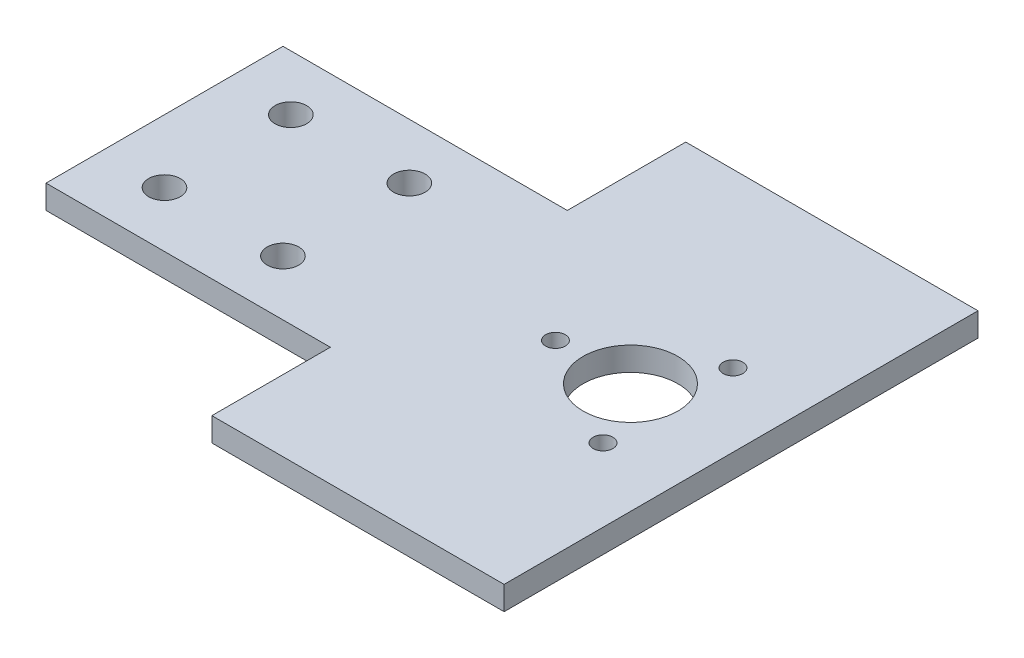
ISO-10303-21;
HEADER;
FILE_DESCRIPTION(('STEP AP214'),'2;1');
FILE_NAME('part.step','',(''),(''),'','','');
FILE_SCHEMA(('AUTOMOTIVE_DESIGN { 1 0 10303 214 1 1 1 1 }'));
ENDSEC;
DATA;
#1=APPLICATION_CONTEXT('core data for automotive mechanical design processes');
#2=APPLICATION_PROTOCOL_DEFINITION('international standard','automotive_design',2000,#1);
#3=PRODUCT_CONTEXT('',#1,'mechanical');
#4=PRODUCT('Part','Part','',(#3));
#5=PRODUCT_RELATED_PRODUCT_CATEGORY('part','',(#4));
#6=PRODUCT_DEFINITION_FORMATION('','',#4);
#7=PRODUCT_DEFINITION_CONTEXT('part definition',#1,'design');
#8=PRODUCT_DEFINITION('design','',#6,#7);
#9=PRODUCT_DEFINITION_SHAPE('','',#8);
#10=(LENGTH_UNIT() NAMED_UNIT(*) SI_UNIT(.MILLI.,.METRE.));
#11=(NAMED_UNIT(*) PLANE_ANGLE_UNIT() SI_UNIT($,.RADIAN.));
#12=(NAMED_UNIT(*) SI_UNIT($,.STERADIAN.) SOLID_ANGLE_UNIT());
#13=UNCERTAINTY_MEASURE_WITH_UNIT(LENGTH_MEASURE(1.E-05),#10,'distance_accuracy_value','');
#14=(GEOMETRIC_REPRESENTATION_CONTEXT(3) GLOBAL_UNCERTAINTY_ASSIGNED_CONTEXT((#13)) GLOBAL_UNIT_ASSIGNED_CONTEXT((#10,
#11,#12)) REPRESENTATION_CONTEXT('',''));
#15=CARTESIAN_POINT('',(0.,0.,0.));
#16=DIRECTION('',(0.,0.,1.));
#17=DIRECTION('',(1.,0.,0.));
#18=AXIS2_PLACEMENT_3D('',#15,#16,#17);
#19=CARTESIAN_POINT('',(36.,3.,0.));
#20=DIRECTION('',(0.,0.,-1.));
#21=DIRECTION('',(-1.,0.,0.));
#22=AXIS2_PLACEMENT_3D('',#19,#20,#21);
#23=PLANE('',#22);
#24=DIRECTION('',(1.,0.,0.));
#25=VECTOR('',#24,1.);
#26=CARTESIAN_POINT('',(36.,0.,0.));
#27=LINE('',#26,#25);
#28=CARTESIAN_POINT('',(0.,0.,0.));
#29=VERTEX_POINT('',#28);
#30=CARTESIAN_POINT('',(36.,0.,0.));
#31=VERTEX_POINT('',#30);
#32=EDGE_CURVE('E129',#29,#31,#27,.T.);
#33=ORIENTED_EDGE('',*,*,#32,.T.);
#34=DIRECTION('',(0.,-1.,0.));
#35=VECTOR('',#34,1.);
#36=CARTESIAN_POINT('',(36.,3.,0.));
#37=LINE('',#36,#35);
#38=CARTESIAN_POINT('',(36.,3.,0.));
#39=VERTEX_POINT('',#38);
#40=EDGE_CURVE('E11',#39,#31,#37,.T.);
#41=ORIENTED_EDGE('',*,*,#40,.F.);
#42=DIRECTION('',(1.,0.,0.));
#43=VECTOR('',#42,1.);
#44=CARTESIAN_POINT('',(36.,3.,0.));
#45=LINE('',#44,#43);
#46=CARTESIAN_POINT('',(0.,3.,0.));
#47=VERTEX_POINT('',#46);
#48=EDGE_CURVE('E144',#47,#39,#45,.T.);
#49=ORIENTED_EDGE('',*,*,#48,.F.);
#50=DIRECTION('',(0.,-1.,0.));
#51=VECTOR('',#50,1.);
#52=CARTESIAN_POINT('',(0.,3.,0.));
#53=LINE('',#52,#51);
#54=EDGE_CURVE('E125',#47,#29,#53,.T.);
#55=ORIENTED_EDGE('',*,*,#54,.T.);
#56=EDGE_LOOP('',(#33,#41,#49,#55));
#57=FACE_BOUND('',#56,.T.);
#58=ADVANCED_FACE('F33',(#57),#23,.F.);
#59=CARTESIAN_POINT('',(36.,3.,15.));
#60=DIRECTION('',(1.,0.,0.));
#61=DIRECTION('',(0.,0.,-1.));
#62=AXIS2_PLACEMENT_3D('',#59,#60,#61);
#63=PLANE('',#62);
#64=DIRECTION('',(0.,0.,1.));
#65=VECTOR('',#64,1.);
#66=CARTESIAN_POINT('',(36.,0.,15.));
#67=LINE('',#66,#65);
#68=CARTESIAN_POINT('',(36.,0.,15.));
#69=VERTEX_POINT('',#68);
#70=EDGE_CURVE('E132',#31,#69,#67,.T.);
#71=ORIENTED_EDGE('',*,*,#70,.T.);
#72=DIRECTION('',(0.,-1.,0.));
#73=VECTOR('',#72,1.);
#74=CARTESIAN_POINT('',(36.,3.,15.));
#75=LINE('',#74,#73);
#76=CARTESIAN_POINT('',(36.,3.,15.));
#77=VERTEX_POINT('',#76);
#78=EDGE_CURVE('E41',#77,#69,#75,.T.);
#79=ORIENTED_EDGE('',*,*,#78,.F.);
#80=DIRECTION('',(0.,0.,1.));
#81=VECTOR('',#80,1.);
#82=CARTESIAN_POINT('',(36.,3.,15.));
#83=LINE('',#82,#81);
#84=EDGE_CURVE('E92',#39,#77,#83,.T.);
#85=ORIENTED_EDGE('',*,*,#84,.F.);
#86=ORIENTED_EDGE('',*,*,#40,.T.);
#87=EDGE_LOOP('',(#71,#79,#85,#86));
#88=FACE_BOUND('',#87,.T.);
#89=ADVANCED_FACE('F268',(#88),#63,.F.);
#90=CARTESIAN_POINT('',(73.,3.,15.));
#91=DIRECTION('',(0.,0.,-1.));
#92=DIRECTION('',(-1.,0.,0.));
#93=AXIS2_PLACEMENT_3D('',#90,#91,#92);
#94=PLANE('',#93);
#95=DIRECTION('',(1.,0.,0.));
#96=VECTOR('',#95,1.);
#97=CARTESIAN_POINT('',(73.,0.,15.));
#98=LINE('',#97,#96);
#99=CARTESIAN_POINT('',(73.,0.,15.));
#100=VERTEX_POINT('',#99);
#101=EDGE_CURVE('E135',#69,#100,#98,.T.);
#102=ORIENTED_EDGE('',*,*,#101,.T.);
#103=DIRECTION('',(0.,-1.,0.));
#104=VECTOR('',#103,1.);
#105=CARTESIAN_POINT('',(73.,3.,15.));
#106=LINE('',#105,#104);
#107=CARTESIAN_POINT('',(73.,3.,15.));
#108=VERTEX_POINT('',#107);
#109=EDGE_CURVE('E151',#108,#100,#106,.T.);
#110=ORIENTED_EDGE('',*,*,#109,.F.);
#111=DIRECTION('',(1.,0.,0.));
#112=VECTOR('',#111,1.);
#113=CARTESIAN_POINT('',(73.,3.,15.));
#114=LINE('',#113,#112);
#115=EDGE_CURVE('E159',#77,#108,#114,.T.);
#116=ORIENTED_EDGE('',*,*,#115,.F.);
#117=ORIENTED_EDGE('',*,*,#78,.T.);
#118=EDGE_LOOP('',(#102,#110,#116,#117));
#119=FACE_BOUND('',#118,.T.);
#120=ADVANCED_FACE('F157',(#119),#94,.F.);
#121=CARTESIAN_POINT('',(73.,3.,-45.));
#122=DIRECTION('',(-1.,0.,0.));
#123=DIRECTION('',(0.,0.,1.));
#124=AXIS2_PLACEMENT_3D('',#121,#122,#123);
#125=PLANE('',#124);
#126=DIRECTION('',(0.,0.,-1.));
#127=VECTOR('',#126,1.);
#128=CARTESIAN_POINT('',(73.,0.,-45.));
#129=LINE('',#128,#127);
#130=CARTESIAN_POINT('',(73.,0.,-45.));
#131=VERTEX_POINT('',#130);
#132=EDGE_CURVE('E137',#100,#131,#129,.T.);
#133=ORIENTED_EDGE('',*,*,#132,.T.);
#134=DIRECTION('',(0.,-1.,0.));
#135=VECTOR('',#134,1.);
#136=CARTESIAN_POINT('',(73.,3.,-45.));
#137=LINE('',#136,#135);
#138=CARTESIAN_POINT('',(73.,3.,-45.));
#139=VERTEX_POINT('',#138);
#140=EDGE_CURVE('E148',#139,#131,#137,.T.);
#141=ORIENTED_EDGE('',*,*,#140,.F.);
#142=DIRECTION('',(0.,0.,-1.));
#143=VECTOR('',#142,1.);
#144=CARTESIAN_POINT('',(73.,3.,-45.));
#145=LINE('',#144,#143);
#146=EDGE_CURVE('E171',#108,#139,#145,.T.);
#147=ORIENTED_EDGE('',*,*,#146,.F.);
#148=ORIENTED_EDGE('',*,*,#109,.T.);
#149=EDGE_LOOP('',(#133,#141,#147,#148));
#150=FACE_BOUND('',#149,.T.);
#151=ADVANCED_FACE('F167',(#150),#125,.F.);
#152=CARTESIAN_POINT('',(36.,3.,-45.));
#153=DIRECTION('',(0.,0.,1.));
#154=DIRECTION('',(1.,0.,0.));
#155=AXIS2_PLACEMENT_3D('',#152,#153,#154);
#156=PLANE('',#155);
#157=DIRECTION('',(-1.,0.,0.));
#158=VECTOR('',#157,1.);
#159=CARTESIAN_POINT('',(36.,0.,-45.));
#160=LINE('',#159,#158);
#161=CARTESIAN_POINT('',(36.,0.,-45.));
#162=VERTEX_POINT('',#161);
#163=EDGE_CURVE('E139',#131,#162,#160,.T.);
#164=ORIENTED_EDGE('',*,*,#163,.T.);
#165=DIRECTION('',(0.,-1.,0.));
#166=VECTOR('',#165,1.);
#167=CARTESIAN_POINT('',(36.,3.,-45.));
#168=LINE('',#167,#166);
#169=CARTESIAN_POINT('',(36.,3.,-45.));
#170=VERTEX_POINT('',#169);
#171=EDGE_CURVE('E120',#170,#162,#168,.T.);
#172=ORIENTED_EDGE('',*,*,#171,.F.);
#173=DIRECTION('',(-1.,0.,0.));
#174=VECTOR('',#173,1.);
#175=CARTESIAN_POINT('',(36.,3.,-45.));
#176=LINE('',#175,#174);
#177=EDGE_CURVE('E111',#139,#170,#176,.T.);
#178=ORIENTED_EDGE('',*,*,#177,.F.);
#179=ORIENTED_EDGE('',*,*,#140,.T.);
#180=EDGE_LOOP('',(#164,#172,#178,#179));
#181=FACE_BOUND('',#180,.T.);
#182=ADVANCED_FACE('F170',(#181),#156,.F.);
#183=CARTESIAN_POINT('',(36.,3.,-30.));
#184=DIRECTION('',(1.,0.,0.));
#185=DIRECTION('',(0.,0.,-1.));
#186=AXIS2_PLACEMENT_3D('',#183,#184,#185);
#187=PLANE('',#186);
#188=DIRECTION('',(0.,0.,1.));
#189=VECTOR('',#188,1.);
#190=CARTESIAN_POINT('',(36.,0.,-30.));
#191=LINE('',#190,#189);
#192=CARTESIAN_POINT('',(36.,0.,-30.));
#193=VERTEX_POINT('',#192);
#194=EDGE_CURVE('E119',#162,#193,#191,.T.);
#195=ORIENTED_EDGE('',*,*,#194,.T.);
#196=DIRECTION('',(0.,-1.,0.));
#197=VECTOR('',#196,1.);
#198=CARTESIAN_POINT('',(36.,3.,-30.));
#199=LINE('',#198,#197);
#200=CARTESIAN_POINT('',(36.,3.,-30.));
#201=VERTEX_POINT('',#200);
#202=EDGE_CURVE('E116',#201,#193,#199,.T.);
#203=ORIENTED_EDGE('',*,*,#202,.F.);
#204=DIRECTION('',(0.,0.,1.));
#205=VECTOR('',#204,1.);
#206=CARTESIAN_POINT('',(36.,3.,-30.));
#207=LINE('',#206,#205);
#208=EDGE_CURVE('E105',#170,#201,#207,.T.);
#209=ORIENTED_EDGE('',*,*,#208,.F.);
#210=ORIENTED_EDGE('',*,*,#171,.T.);
#211=EDGE_LOOP('',(#195,#203,#209,#210));
#212=FACE_BOUND('',#211,.T.);
#213=ADVANCED_FACE('F117',(#212),#187,.F.);
#214=CARTESIAN_POINT('',(0.,3.,-30.));
#215=DIRECTION('',(0.,0.,1.));
#216=DIRECTION('',(1.,0.,0.));
#217=AXIS2_PLACEMENT_3D('',#214,#215,#216);
#218=PLANE('',#217);
#219=DIRECTION('',(-1.,0.,0.));
#220=VECTOR('',#219,1.);
#221=CARTESIAN_POINT('',(0.,0.,-30.));
#222=LINE('',#221,#220);
#223=CARTESIAN_POINT('',(0.,0.,-30.));
#224=VERTEX_POINT('',#223);
#225=EDGE_CURVE('E78',#193,#224,#222,.T.);
#226=ORIENTED_EDGE('',*,*,#225,.T.);
#227=DIRECTION('',(0.,-1.,0.));
#228=VECTOR('',#227,1.);
#229=CARTESIAN_POINT('',(0.,3.,-30.));
#230=LINE('',#229,#228);
#231=CARTESIAN_POINT('',(0.,3.,-30.));
#232=VERTEX_POINT('',#231);
#233=EDGE_CURVE('E121',#232,#224,#230,.T.);
#234=ORIENTED_EDGE('',*,*,#233,.F.);
#235=DIRECTION('',(-1.,0.,0.));
#236=VECTOR('',#235,1.);
#237=CARTESIAN_POINT('',(0.,3.,-30.));
#238=LINE('',#237,#236);
#239=EDGE_CURVE('E109',#201,#232,#238,.T.);
#240=ORIENTED_EDGE('',*,*,#239,.F.);
#241=ORIENTED_EDGE('',*,*,#202,.T.);
#242=EDGE_LOOP('',(#226,#234,#240,#241));
#243=FACE_BOUND('',#242,.T.);
#244=ADVANCED_FACE('F123',(#243),#218,.F.);
#245=CARTESIAN_POINT('',(0.,3.,0.));
#246=DIRECTION('',(1.,0.,0.));
#247=DIRECTION('',(0.,0.,-1.));
#248=AXIS2_PLACEMENT_3D('',#245,#246,#247);
#249=PLANE('',#248);
#250=DIRECTION('',(0.,0.,1.));
#251=VECTOR('',#250,1.);
#252=CARTESIAN_POINT('',(0.,0.,0.));
#253=LINE('',#252,#251);
#254=EDGE_CURVE('E84',#224,#29,#253,.T.);
#255=ORIENTED_EDGE('',*,*,#254,.T.);
#256=ORIENTED_EDGE('',*,*,#54,.F.);
#257=DIRECTION('',(0.,0.,1.));
#258=VECTOR('',#257,1.);
#259=CARTESIAN_POINT('',(0.,3.,0.));
#260=LINE('',#259,#258);
#261=EDGE_CURVE('E49',#232,#47,#260,.T.);
#262=ORIENTED_EDGE('',*,*,#261,.F.);
#263=ORIENTED_EDGE('',*,*,#233,.T.);
#264=EDGE_LOOP('',(#255,#256,#262,#263));
#265=FACE_BOUND('',#264,.T.);
#266=ADVANCED_FACE('F236',(#265),#249,.F.);
#267=CARTESIAN_POINT('',(0.,3.,0.));
#268=DIRECTION('',(0.,-1.,0.));
#269=DIRECTION('',(0.,0.,-1.));
#270=AXIS2_PLACEMENT_3D('',#267,#268,#269);
#271=PLANE('',#270);
#272=CARTESIAN_POINT('',(63.75,3.,-23.2272413359521));
#273=DIRECTION('',(0.,1.,0.));
#274=DIRECTION('',(0.,0.,1.));
#275=AXIS2_PLACEMENT_3D('',#272,#273,#274);
#276=CIRCLE('',#275,1.25000000000001);
#277=CARTESIAN_POINT('',(63.75,3.,-21.9772413359521));
#278=VERTEX_POINT('',#277);
#279=EDGE_CURVE('E219',#278,#278,#276,.T.);
#280=ORIENTED_EDGE('',*,*,#279,.F.);
#281=EDGE_LOOP('',(#280));
#282=FACE_BOUND('',#281,.T.);
#283=CARTESIAN_POINT('',(63.75,3.,-6.77275866404786));
#284=DIRECTION('',(0.,1.,0.));
#285=DIRECTION('',(0.,0.,1.));
#286=AXIS2_PLACEMENT_3D('',#283,#284,#285);
#287=CIRCLE('',#286,1.24999999999997);
#288=CARTESIAN_POINT('',(63.75,3.,-5.52275866404789));
#289=VERTEX_POINT('',#288);
#290=EDGE_CURVE('E213',#289,#289,#287,.T.);
#291=ORIENTED_EDGE('',*,*,#290,.F.);
#292=EDGE_LOOP('',(#291));
#293=FACE_BOUND('',#292,.T.);
#294=CARTESIAN_POINT('',(49.5,3.,-15.));
#295=DIRECTION('',(0.,1.,0.));
#296=DIRECTION('',(0.,0.,1.));
#297=AXIS2_PLACEMENT_3D('',#294,#295,#296);
#298=CIRCLE('',#297,1.25000000000001);
#299=CARTESIAN_POINT('',(49.5,3.,-13.75));
#300=VERTEX_POINT('',#299);
#301=EDGE_CURVE('E207',#300,#300,#298,.T.);
#302=ORIENTED_EDGE('',*,*,#301,.F.);
#303=EDGE_LOOP('',(#302));
#304=FACE_BOUND('',#303,.T.);
#305=CARTESIAN_POINT('',(23.,3.,-23.));
#306=DIRECTION('',(0.,1.,0.));
#307=DIRECTION('',(0.,0.,1.));
#308=AXIS2_PLACEMENT_3D('',#305,#306,#307);
#309=CIRCLE('',#308,2.);
#310=CARTESIAN_POINT('',(23.,3.,-21.));
#311=VERTEX_POINT('',#310);
#312=EDGE_CURVE('E190',#311,#311,#309,.T.);
#313=ORIENTED_EDGE('',*,*,#312,.F.);
#314=EDGE_LOOP('',(#313));
#315=FACE_BOUND('',#314,.T.);
#316=CARTESIAN_POINT('',(8.,3.,-7.));
#317=DIRECTION('',(0.,1.,0.));
#318=DIRECTION('',(0.,0.,1.));
#319=AXIS2_PLACEMENT_3D('',#316,#317,#318);
#320=CIRCLE('',#319,2.);
#321=CARTESIAN_POINT('',(8.,3.,-5.));
#322=VERTEX_POINT('',#321);
#323=EDGE_CURVE('E183',#322,#322,#320,.T.);
#324=ORIENTED_EDGE('',*,*,#323,.F.);
#325=EDGE_LOOP('',(#324));
#326=FACE_BOUND('',#325,.T.);
#327=CARTESIAN_POINT('',(23.,3.,-7.));
#328=DIRECTION('',(0.,1.,0.));
#329=DIRECTION('',(0.,0.,1.));
#330=AXIS2_PLACEMENT_3D('',#327,#328,#329);
#331=CIRCLE('',#330,2.);
#332=CARTESIAN_POINT('',(23.,3.,-5.));
#333=VERTEX_POINT('',#332);
#334=EDGE_CURVE('E202',#333,#333,#331,.T.);
#335=ORIENTED_EDGE('',*,*,#334,.F.);
#336=EDGE_LOOP('',(#335));
#337=FACE_BOUND('',#336,.T.);
#338=CARTESIAN_POINT('',(59.,3.,-15.));
#339=DIRECTION('',(0.,1.,0.));
#340=DIRECTION('',(0.,0.,1.));
#341=AXIS2_PLACEMENT_3D('',#338,#339,#340);
#342=CIRCLE('',#341,6.);
#343=CARTESIAN_POINT('',(59.,3.,-9.));
#344=VERTEX_POINT('',#343);
#345=EDGE_CURVE('E195',#344,#344,#342,.T.);
#346=ORIENTED_EDGE('',*,*,#345,.F.);
#347=EDGE_LOOP('',(#346));
#348=FACE_BOUND('',#347,.T.);
#349=CARTESIAN_POINT('',(8.,3.,-23.));
#350=DIRECTION('',(0.,1.,0.));
#351=DIRECTION('',(0.,0.,1.));
#352=AXIS2_PLACEMENT_3D('',#349,#350,#351);
#353=CIRCLE('',#352,2.);
#354=CARTESIAN_POINT('',(8.,3.,-21.));
#355=VERTEX_POINT('',#354);
#356=EDGE_CURVE('E177',#355,#355,#353,.T.);
#357=ORIENTED_EDGE('',*,*,#356,.F.);
#358=EDGE_LOOP('',(#357));
#359=FACE_BOUND('',#358,.T.);
#360=ORIENTED_EDGE('',*,*,#48,.T.);
#361=ORIENTED_EDGE('',*,*,#84,.T.);
#362=ORIENTED_EDGE('',*,*,#115,.T.);
#363=ORIENTED_EDGE('',*,*,#146,.T.);
#364=ORIENTED_EDGE('',*,*,#177,.T.);
#365=ORIENTED_EDGE('',*,*,#208,.T.);
#366=ORIENTED_EDGE('',*,*,#239,.T.);
#367=ORIENTED_EDGE('',*,*,#261,.T.);
#368=EDGE_LOOP('',(#360,#361,#362,#363,#364,#365,#366,#367));
#369=FACE_BOUND('',#368,.T.);
#370=ADVANCED_FACE('F107',(#282,#293,#304,#315,#326,#337,#348,#359,#369),#271,.F.);
#371=CARTESIAN_POINT('',(0.,0.,0.));
#372=DIRECTION('',(0.,-1.,0.));
#373=DIRECTION('',(0.,0.,-1.));
#374=AXIS2_PLACEMENT_3D('',#371,#372,#373);
#375=PLANE('',#374);
#376=CARTESIAN_POINT('',(63.75,0.,-23.2272413359521));
#377=DIRECTION('',(0.,1.,0.));
#378=DIRECTION('',(0.,0.,1.));
#379=AXIS2_PLACEMENT_3D('',#376,#377,#378);
#380=CIRCLE('',#379,1.25000000000001);
#381=CARTESIAN_POINT('',(63.75,0.,-21.9772413359521));
#382=VERTEX_POINT('',#381);
#383=EDGE_CURVE('E199',#382,#382,#380,.T.);
#384=ORIENTED_EDGE('',*,*,#383,.T.);
#385=EDGE_LOOP('',(#384));
#386=FACE_BOUND('',#385,.T.);
#387=CARTESIAN_POINT('',(63.75,0.,-6.77275866404786));
#388=DIRECTION('',(0.,1.,0.));
#389=DIRECTION('',(0.,0.,1.));
#390=AXIS2_PLACEMENT_3D('',#387,#388,#389);
#391=CIRCLE('',#390,1.24999999999997);
#392=CARTESIAN_POINT('',(63.75,0.,-5.52275866404789));
#393=VERTEX_POINT('',#392);
#394=EDGE_CURVE('E216',#393,#393,#391,.T.);
#395=ORIENTED_EDGE('',*,*,#394,.T.);
#396=EDGE_LOOP('',(#395));
#397=FACE_BOUND('',#396,.T.);
#398=CARTESIAN_POINT('',(49.5,0.,-15.));
#399=DIRECTION('',(0.,1.,0.));
#400=DIRECTION('',(0.,0.,1.));
#401=AXIS2_PLACEMENT_3D('',#398,#399,#400);
#402=CIRCLE('',#401,1.25000000000001);
#403=CARTESIAN_POINT('',(49.5,0.,-13.75));
#404=VERTEX_POINT('',#403);
#405=EDGE_CURVE('E210',#404,#404,#402,.T.);
#406=ORIENTED_EDGE('',*,*,#405,.T.);
#407=EDGE_LOOP('',(#406));
#408=FACE_BOUND('',#407,.T.);
#409=CARTESIAN_POINT('',(23.,0.,-23.));
#410=DIRECTION('',(0.,1.,0.));
#411=DIRECTION('',(0.,0.,1.));
#412=AXIS2_PLACEMENT_3D('',#409,#410,#411);
#413=CIRCLE('',#412,2.);
#414=CARTESIAN_POINT('',(23.,0.,-21.));
#415=VERTEX_POINT('',#414);
#416=EDGE_CURVE('E180',#415,#415,#413,.T.);
#417=ORIENTED_EDGE('',*,*,#416,.T.);
#418=EDGE_LOOP('',(#417));
#419=FACE_BOUND('',#418,.T.);
#420=CARTESIAN_POINT('',(8.,0.,-7.));
#421=DIRECTION('',(0.,1.,0.));
#422=DIRECTION('',(0.,0.,1.));
#423=AXIS2_PLACEMENT_3D('',#420,#421,#422);
#424=CIRCLE('',#423,2.);
#425=CARTESIAN_POINT('',(8.,0.,-5.));
#426=VERTEX_POINT('',#425);
#427=EDGE_CURVE('E186',#426,#426,#424,.T.);
#428=ORIENTED_EDGE('',*,*,#427,.T.);
#429=EDGE_LOOP('',(#428));
#430=FACE_BOUND('',#429,.T.);
#431=CARTESIAN_POINT('',(23.,0.,-7.));
#432=DIRECTION('',(0.,1.,0.));
#433=DIRECTION('',(0.,0.,1.));
#434=AXIS2_PLACEMENT_3D('',#431,#432,#433);
#435=CIRCLE('',#434,2.);
#436=CARTESIAN_POINT('',(23.,0.,-5.));
#437=VERTEX_POINT('',#436);
#438=EDGE_CURVE('E187',#437,#437,#435,.T.);
#439=ORIENTED_EDGE('',*,*,#438,.T.);
#440=EDGE_LOOP('',(#439));
#441=FACE_BOUND('',#440,.T.);
#442=CARTESIAN_POINT('',(59.,0.,-15.));
#443=DIRECTION('',(0.,1.,0.));
#444=DIRECTION('',(0.,0.,1.));
#445=AXIS2_PLACEMENT_3D('',#442,#443,#444);
#446=CIRCLE('',#445,6.);
#447=CARTESIAN_POINT('',(59.,0.,-9.));
#448=VERTEX_POINT('',#447);
#449=EDGE_CURVE('E198',#448,#448,#446,.T.);
#450=ORIENTED_EDGE('',*,*,#449,.T.);
#451=EDGE_LOOP('',(#450));
#452=FACE_BOUND('',#451,.T.);
#453=CARTESIAN_POINT('',(8.,0.,-23.));
#454=DIRECTION('',(0.,1.,0.));
#455=DIRECTION('',(0.,0.,1.));
#456=AXIS2_PLACEMENT_3D('',#453,#454,#455);
#457=CIRCLE('',#456,2.);
#458=CARTESIAN_POINT('',(8.,0.,-21.));
#459=VERTEX_POINT('',#458);
#460=EDGE_CURVE('E133',#459,#459,#457,.T.);
#461=ORIENTED_EDGE('',*,*,#460,.T.);
#462=EDGE_LOOP('',(#461));
#463=FACE_BOUND('',#462,.T.);
#464=ORIENTED_EDGE('',*,*,#32,.F.);
#465=ORIENTED_EDGE('',*,*,#254,.F.);
#466=ORIENTED_EDGE('',*,*,#225,.F.);
#467=ORIENTED_EDGE('',*,*,#194,.F.);
#468=ORIENTED_EDGE('',*,*,#163,.F.);
#469=ORIENTED_EDGE('',*,*,#132,.F.);
#470=ORIENTED_EDGE('',*,*,#101,.F.);
#471=ORIENTED_EDGE('',*,*,#70,.F.);
#472=EDGE_LOOP('',(#464,#465,#466,#467,#468,#469,#470,#471));
#473=FACE_BOUND('',#472,.T.);
#474=ADVANCED_FACE('F163',(#386,#397,#408,#419,#430,#441,#452,#463,#473),#375,.T.);
#475=CARTESIAN_POINT('',(8.,0.,-23.));
#476=DIRECTION('',(0.,1.,0.));
#477=DIRECTION('',(0.,0.,1.));
#478=AXIS2_PLACEMENT_3D('',#475,#476,#477);
#479=CYLINDRICAL_SURFACE('',#478,2.);
#480=ORIENTED_EDGE('',*,*,#460,.F.);
#481=EDGE_LOOP('',(#480));
#482=FACE_BOUND('',#481,.T.);
#483=ORIENTED_EDGE('',*,*,#356,.T.);
#484=EDGE_LOOP('',(#483));
#485=FACE_BOUND('',#484,.T.);
#486=ADVANCED_FACE('F252',(#482,#485),#479,.F.);
#487=CARTESIAN_POINT('',(59.,0.,-15.));
#488=DIRECTION('',(0.,1.,0.));
#489=DIRECTION('',(0.,0.,1.));
#490=AXIS2_PLACEMENT_3D('',#487,#488,#489);
#491=CYLINDRICAL_SURFACE('',#490,6.);
#492=ORIENTED_EDGE('',*,*,#449,.F.);
#493=EDGE_LOOP('',(#492));
#494=FACE_BOUND('',#493,.T.);
#495=ORIENTED_EDGE('',*,*,#345,.T.);
#496=EDGE_LOOP('',(#495));
#497=FACE_BOUND('',#496,.T.);
#498=ADVANCED_FACE('F254',(#494,#497),#491,.F.);
#499=CARTESIAN_POINT('',(23.,0.,-7.));
#500=DIRECTION('',(0.,1.,0.));
#501=DIRECTION('',(0.,0.,1.));
#502=AXIS2_PLACEMENT_3D('',#499,#500,#501);
#503=CYLINDRICAL_SURFACE('',#502,2.);
#504=ORIENTED_EDGE('',*,*,#438,.F.);
#505=EDGE_LOOP('',(#504));
#506=FACE_BOUND('',#505,.T.);
#507=ORIENTED_EDGE('',*,*,#334,.T.);
#508=EDGE_LOOP('',(#507));
#509=FACE_BOUND('',#508,.T.);
#510=ADVANCED_FACE('F261',(#506,#509),#503,.F.);
#511=CARTESIAN_POINT('',(8.,0.,-7.));
#512=DIRECTION('',(0.,1.,0.));
#513=DIRECTION('',(0.,0.,1.));
#514=AXIS2_PLACEMENT_3D('',#511,#512,#513);
#515=CYLINDRICAL_SURFACE('',#514,2.);
#516=ORIENTED_EDGE('',*,*,#427,.F.);
#517=EDGE_LOOP('',(#516));
#518=FACE_BOUND('',#517,.T.);
#519=ORIENTED_EDGE('',*,*,#323,.T.);
#520=EDGE_LOOP('',(#519));
#521=FACE_BOUND('',#520,.T.);
#522=ADVANCED_FACE('F334',(#518,#521),#515,.F.);
#523=CARTESIAN_POINT('',(23.,0.,-23.));
#524=DIRECTION('',(0.,1.,0.));
#525=DIRECTION('',(0.,0.,1.));
#526=AXIS2_PLACEMENT_3D('',#523,#524,#525);
#527=CYLINDRICAL_SURFACE('',#526,2.);
#528=ORIENTED_EDGE('',*,*,#416,.F.);
#529=EDGE_LOOP('',(#528));
#530=FACE_BOUND('',#529,.T.);
#531=ORIENTED_EDGE('',*,*,#312,.T.);
#532=EDGE_LOOP('',(#531));
#533=FACE_BOUND('',#532,.T.);
#534=ADVANCED_FACE('F344',(#530,#533),#527,.F.);
#535=CARTESIAN_POINT('',(49.5,0.,-15.));
#536=DIRECTION('',(0.,1.,0.));
#537=DIRECTION('',(0.,0.,1.));
#538=AXIS2_PLACEMENT_3D('',#535,#536,#537);
#539=CYLINDRICAL_SURFACE('',#538,1.25000000000001);
#540=ORIENTED_EDGE('',*,*,#405,.F.);
#541=EDGE_LOOP('',(#540));
#542=FACE_BOUND('',#541,.T.);
#543=ORIENTED_EDGE('',*,*,#301,.T.);
#544=EDGE_LOOP('',(#543));
#545=FACE_BOUND('',#544,.T.);
#546=ADVANCED_FACE('F353',(#542,#545),#539,.F.);
#547=CARTESIAN_POINT('',(63.75,0.,-6.77275866404786));
#548=DIRECTION('',(0.,1.,0.));
#549=DIRECTION('',(0.,0.,1.));
#550=AXIS2_PLACEMENT_3D('',#547,#548,#549);
#551=CYLINDRICAL_SURFACE('',#550,1.24999999999997);
#552=ORIENTED_EDGE('',*,*,#394,.F.);
#553=EDGE_LOOP('',(#552));
#554=FACE_BOUND('',#553,.T.);
#555=ORIENTED_EDGE('',*,*,#290,.T.);
#556=EDGE_LOOP('',(#555));
#557=FACE_BOUND('',#556,.T.);
#558=ADVANCED_FACE('F230',(#554,#557),#551,.F.);
#559=CARTESIAN_POINT('',(63.75,0.,-23.2272413359521));
#560=DIRECTION('',(0.,1.,0.));
#561=DIRECTION('',(0.,0.,1.));
#562=AXIS2_PLACEMENT_3D('',#559,#560,#561);
#563=CYLINDRICAL_SURFACE('',#562,1.25000000000001);
#564=ORIENTED_EDGE('',*,*,#383,.F.);
#565=EDGE_LOOP('',(#564));
#566=FACE_BOUND('',#565,.T.);
#567=ORIENTED_EDGE('',*,*,#279,.T.);
#568=EDGE_LOOP('',(#567));
#569=FACE_BOUND('',#568,.T.);
#570=ADVANCED_FACE('F227',(#566,#569),#563,.F.);
#571=CLOSED_SHELL('',(#58,#89,#120,#151,#182,#213,#244,#266,#370,#474,#486,#498,#510,#522,#534,
#546,#558,#570));
#572=MANIFOLD_SOLID_BREP('B2',#571);
#573=ADVANCED_BREP_SHAPE_REPRESENTATION('',(#18,#572),#14);
#574=SHAPE_DEFINITION_REPRESENTATION(#9,#573);
ENDSEC;
END-ISO-10303-21;
